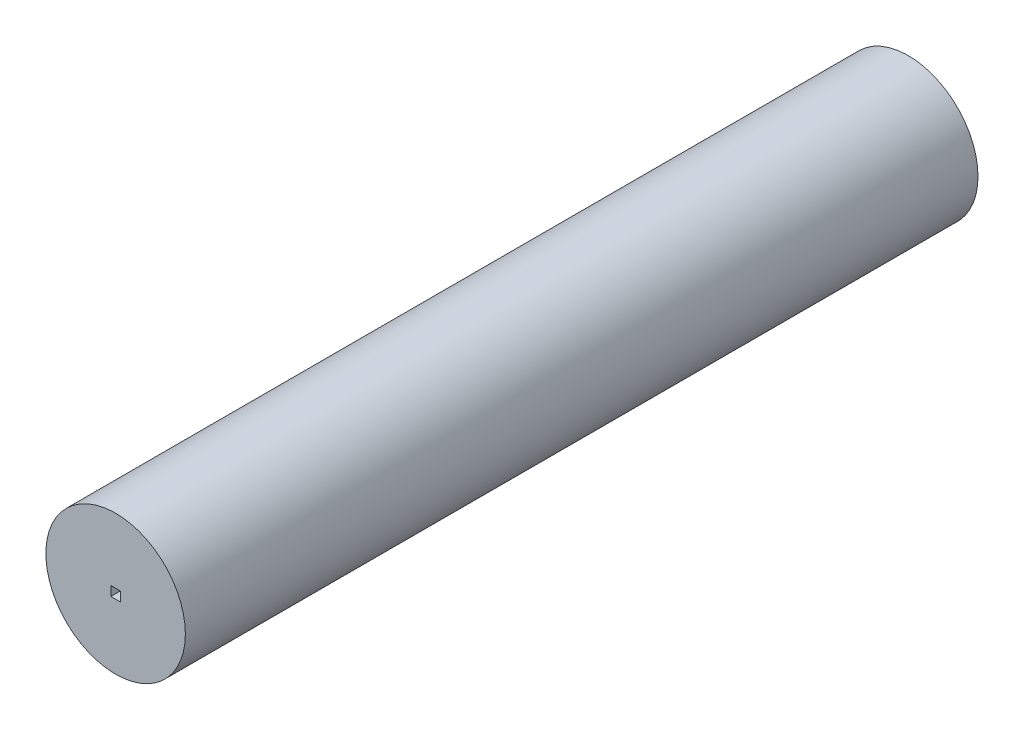
ISO-10303-21;
HEADER;
FILE_DESCRIPTION(('STEP AP214'),'2;1');
FILE_NAME('part.step','',(''),(''),'','','');
FILE_SCHEMA(('AUTOMOTIVE_DESIGN { 1 0 10303 214 1 1 1 1 }'));
ENDSEC;
DATA;
#1=APPLICATION_CONTEXT('core data for automotive mechanical design processes');
#2=APPLICATION_PROTOCOL_DEFINITION('international standard','automotive_design',2000,#1);
#3=PRODUCT_CONTEXT('',#1,'mechanical');
#4=PRODUCT('Part','Part','',(#3));
#5=PRODUCT_RELATED_PRODUCT_CATEGORY('part','',(#4));
#6=PRODUCT_DEFINITION_FORMATION('','',#4);
#7=PRODUCT_DEFINITION_CONTEXT('part definition',#1,'design');
#8=PRODUCT_DEFINITION('design','',#6,#7);
#9=PRODUCT_DEFINITION_SHAPE('','',#8);
#10=(LENGTH_UNIT() NAMED_UNIT(*) SI_UNIT(.MILLI.,.METRE.));
#11=(NAMED_UNIT(*) PLANE_ANGLE_UNIT() SI_UNIT($,.RADIAN.));
#12=(NAMED_UNIT(*) SI_UNIT($,.STERADIAN.) SOLID_ANGLE_UNIT());
#13=UNCERTAINTY_MEASURE_WITH_UNIT(LENGTH_MEASURE(1.E-05),#10,'distance_accuracy_value','');
#14=(GEOMETRIC_REPRESENTATION_CONTEXT(3) GLOBAL_UNCERTAINTY_ASSIGNED_CONTEXT((#13)) GLOBAL_UNIT_ASSIGNED_CONTEXT((#10,
#11,#12)) REPRESENTATION_CONTEXT('',''));
#15=CARTESIAN_POINT('',(0.,0.,0.));
#16=DIRECTION('',(0.,0.,1.));
#17=DIRECTION('',(1.,0.,0.));
#18=AXIS2_PLACEMENT_3D('',#15,#16,#17);
#19=CARTESIAN_POINT('',(0.,0.,250.));
#20=DIRECTION('',(0.,0.,-1.));
#21=DIRECTION('',(-1.,0.,0.));
#22=AXIS2_PLACEMENT_3D('',#19,#20,#21);
#23=CYLINDRICAL_SURFACE('',#22,22.);
#24=CARTESIAN_POINT('',(0.,0.,250.));
#25=DIRECTION('',(0.,0.,1.));
#26=DIRECTION('',(1.,0.,0.));
#27=AXIS2_PLACEMENT_3D('',#24,#25,#26);
#28=CIRCLE('',#27,22.);
#29=CARTESIAN_POINT('',(22.,0.,250.));
#30=VERTEX_POINT('',#29);
#31=EDGE_CURVE('E11',#30,#30,#28,.T.);
#32=ORIENTED_EDGE('',*,*,#31,.F.);
#33=EDGE_LOOP('',(#32));
#34=FACE_BOUND('',#33,.T.);
#35=CARTESIAN_POINT('',(0.,0.,0.));
#36=DIRECTION('',(0.,0.,1.));
#37=DIRECTION('',(1.,0.,0.));
#38=AXIS2_PLACEMENT_3D('',#35,#36,#37);
#39=CIRCLE('',#38,22.);
#40=CARTESIAN_POINT('',(22.,0.,0.));
#41=VERTEX_POINT('',#40);
#42=EDGE_CURVE('E36',#41,#41,#39,.T.);
#43=ORIENTED_EDGE('',*,*,#42,.T.);
#44=EDGE_LOOP('',(#43));
#45=FACE_BOUND('',#44,.T.);
#46=ADVANCED_FACE('F33',(#34,#45),#23,.T.);
#47=CARTESIAN_POINT('',(0.,0.,250.));
#48=DIRECTION('',(0.,0.,1.));
#49=DIRECTION('',(1.,0.,0.));
#50=AXIS2_PLACEMENT_3D('',#47,#48,#49);
#51=PLANE('',#50);
#52=DIRECTION('',(0.,-1.,0.));
#53=VECTOR('',#52,1.);
#54=CARTESIAN_POINT('',(-1.5,1.5,250.));
#55=LINE('',#54,#53);
#56=CARTESIAN_POINT('',(-1.5,1.5,250.));
#57=VERTEX_POINT('',#56);
#58=CARTESIAN_POINT('',(-1.5,-1.5,250.));
#59=VERTEX_POINT('',#58);
#60=EDGE_CURVE('E47',#57,#59,#55,.T.);
#61=ORIENTED_EDGE('',*,*,#60,.F.);
#62=DIRECTION('',(-1.,0.,0.));
#63=VECTOR('',#62,1.);
#64=CARTESIAN_POINT('',(1.5,1.5,250.));
#65=LINE('',#64,#63);
#66=CARTESIAN_POINT('',(1.5,1.5,250.));
#67=VERTEX_POINT('',#66);
#68=EDGE_CURVE('E98',#67,#57,#65,.T.);
#69=ORIENTED_EDGE('',*,*,#68,.F.);
#70=DIRECTION('',(0.,1.,0.));
#71=VECTOR('',#70,1.);
#72=CARTESIAN_POINT('',(1.5,1.5,250.));
#73=LINE('',#72,#71);
#74=CARTESIAN_POINT('',(1.5,-1.5,250.));
#75=VERTEX_POINT('',#74);
#76=EDGE_CURVE('E104',#75,#67,#73,.T.);
#77=ORIENTED_EDGE('',*,*,#76,.F.);
#78=DIRECTION('',(1.,0.,0.));
#79=VECTOR('',#78,1.);
#80=CARTESIAN_POINT('',(1.5,-1.5,250.));
#81=LINE('',#80,#79);
#82=EDGE_CURVE('E82',#59,#75,#81,.T.);
#83=ORIENTED_EDGE('',*,*,#82,.F.);
#84=EDGE_LOOP('',(#61,#69,#77,#83));
#85=FACE_BOUND('',#84,.T.);
#86=ORIENTED_EDGE('',*,*,#31,.T.);
#87=EDGE_LOOP('',(#86));
#88=FACE_BOUND('',#87,.T.);
#89=ADVANCED_FACE('F110',(#85,#88),#51,.T.);
#90=CARTESIAN_POINT('',(0.,0.,0.));
#91=DIRECTION('',(0.,0.,1.));
#92=DIRECTION('',(1.,0.,0.));
#93=AXIS2_PLACEMENT_3D('',#90,#91,#92);
#94=PLANE('',#93);
#95=ORIENTED_EDGE('',*,*,#42,.F.);
#96=EDGE_LOOP('',(#95));
#97=FACE_BOUND('',#96,.T.);
#98=ADVANCED_FACE('F122',(#97),#94,.F.);
#99=CARTESIAN_POINT('',(-1.5,1.5,130.));
#100=DIRECTION('',(-1.,0.,0.));
#101=DIRECTION('',(0.,-1.,0.));
#102=AXIS2_PLACEMENT_3D('',#99,#100,#101);
#103=PLANE('',#102);
#104=ORIENTED_EDGE('',*,*,#60,.T.);
#105=DIRECTION('',(0.,0.,1.));
#106=VECTOR('',#105,1.);
#107=CARTESIAN_POINT('',(-1.5,-1.5,130.));
#108=LINE('',#107,#106);
#109=CARTESIAN_POINT('',(-1.5,-1.5,130.));
#110=VERTEX_POINT('',#109);
#111=EDGE_CURVE('E70',#110,#59,#108,.T.);
#112=ORIENTED_EDGE('',*,*,#111,.F.);
#113=DIRECTION('',(0.,-1.,0.));
#114=VECTOR('',#113,1.);
#115=CARTESIAN_POINT('',(-1.5,1.5,130.));
#116=LINE('',#115,#114);
#117=CARTESIAN_POINT('',(-1.5,1.5,130.));
#118=VERTEX_POINT('',#117);
#119=EDGE_CURVE('E96',#118,#110,#116,.T.);
#120=ORIENTED_EDGE('',*,*,#119,.F.);
#121=DIRECTION('',(0.,0.,1.));
#122=VECTOR('',#121,1.);
#123=CARTESIAN_POINT('',(-1.5,1.5,130.));
#124=LINE('',#123,#122);
#125=EDGE_CURVE('E55',#118,#57,#124,.T.);
#126=ORIENTED_EDGE('',*,*,#125,.T.);
#127=EDGE_LOOP('',(#104,#112,#120,#126));
#128=FACE_BOUND('',#127,.T.);
#129=ADVANCED_FACE('F115',(#128),#103,.F.);
#130=CARTESIAN_POINT('',(1.5,1.5,130.));
#131=DIRECTION('',(0.,1.,0.));
#132=DIRECTION('',(0.,0.,1.));
#133=AXIS2_PLACEMENT_3D('',#130,#131,#132);
#134=PLANE('',#133);
#135=ORIENTED_EDGE('',*,*,#68,.T.);
#136=ORIENTED_EDGE('',*,*,#125,.F.);
#137=DIRECTION('',(-1.,0.,0.));
#138=VECTOR('',#137,1.);
#139=CARTESIAN_POINT('',(1.5,1.5,130.));
#140=LINE('',#139,#138);
#141=CARTESIAN_POINT('',(1.5,1.5,130.));
#142=VERTEX_POINT('',#141);
#143=EDGE_CURVE('E93',#142,#118,#140,.T.);
#144=ORIENTED_EDGE('',*,*,#143,.F.);
#145=DIRECTION('',(0.,0.,1.));
#146=VECTOR('',#145,1.);
#147=CARTESIAN_POINT('',(1.5,1.5,130.));
#148=LINE('',#147,#146);
#149=EDGE_CURVE('E86',#142,#67,#148,.T.);
#150=ORIENTED_EDGE('',*,*,#149,.T.);
#151=EDGE_LOOP('',(#135,#136,#144,#150));
#152=FACE_BOUND('',#151,.T.);
#153=ADVANCED_FACE('F113',(#152),#134,.F.);
#154=CARTESIAN_POINT('',(1.5,1.5,130.));
#155=DIRECTION('',(1.,0.,0.));
#156=DIRECTION('',(0.,1.,0.));
#157=AXIS2_PLACEMENT_3D('',#154,#155,#156);
#158=PLANE('',#157);
#159=ORIENTED_EDGE('',*,*,#76,.T.);
#160=ORIENTED_EDGE('',*,*,#149,.F.);
#161=DIRECTION('',(0.,1.,0.));
#162=VECTOR('',#161,1.);
#163=CARTESIAN_POINT('',(1.5,1.5,130.));
#164=LINE('',#163,#162);
#165=CARTESIAN_POINT('',(1.5,-1.5,130.));
#166=VERTEX_POINT('',#165);
#167=EDGE_CURVE('E89',#166,#142,#164,.T.);
#168=ORIENTED_EDGE('',*,*,#167,.F.);
#169=DIRECTION('',(0.,0.,1.));
#170=VECTOR('',#169,1.);
#171=CARTESIAN_POINT('',(1.5,-1.5,130.));
#172=LINE('',#171,#170);
#173=EDGE_CURVE('E75',#166,#75,#172,.T.);
#174=ORIENTED_EDGE('',*,*,#173,.T.);
#175=EDGE_LOOP('',(#159,#160,#168,#174));
#176=FACE_BOUND('',#175,.T.);
#177=ADVANCED_FACE('F90',(#176),#158,.F.);
#178=CARTESIAN_POINT('',(1.5,-1.5,130.));
#179=DIRECTION('',(0.,-1.,0.));
#180=DIRECTION('',(1.,0.,0.));
#181=AXIS2_PLACEMENT_3D('',#178,#179,#180);
#182=PLANE('',#181);
#183=ORIENTED_EDGE('',*,*,#82,.T.);
#184=ORIENTED_EDGE('',*,*,#173,.F.);
#185=DIRECTION('',(1.,0.,0.));
#186=VECTOR('',#185,1.);
#187=CARTESIAN_POINT('',(1.5,-1.5,130.));
#188=LINE('',#187,#186);
#189=EDGE_CURVE('E79',#110,#166,#188,.T.);
#190=ORIENTED_EDGE('',*,*,#189,.F.);
#191=ORIENTED_EDGE('',*,*,#111,.T.);
#192=EDGE_LOOP('',(#183,#184,#190,#191));
#193=FACE_BOUND('',#192,.T.);
#194=ADVANCED_FACE('F77',(#193),#182,.F.);
#195=CARTESIAN_POINT('',(0.,0.,130.));
#196=DIRECTION('',(0.,0.,-1.));
#197=DIRECTION('',(-1.,0.,0.));
#198=AXIS2_PLACEMENT_3D('',#195,#196,#197);
#199=PLANE('',#198);
#200=ORIENTED_EDGE('',*,*,#119,.T.);
#201=ORIENTED_EDGE('',*,*,#189,.T.);
#202=ORIENTED_EDGE('',*,*,#167,.T.);
#203=ORIENTED_EDGE('',*,*,#143,.T.);
#204=EDGE_LOOP('',(#200,#201,#202,#203));
#205=FACE_BOUND('',#204,.T.);
#206=ADVANCED_FACE('F95',(#205),#199,.F.);
#207=CLOSED_SHELL('',(#46,#89,#98,#129,#153,#177,#194,#206));
#208=MANIFOLD_SOLID_BREP('B2',#207);
#209=ADVANCED_BREP_SHAPE_REPRESENTATION('',(#18,#208),#14);
#210=SHAPE_DEFINITION_REPRESENTATION(#9,#209);
ENDSEC;
END-ISO-10303-21;
